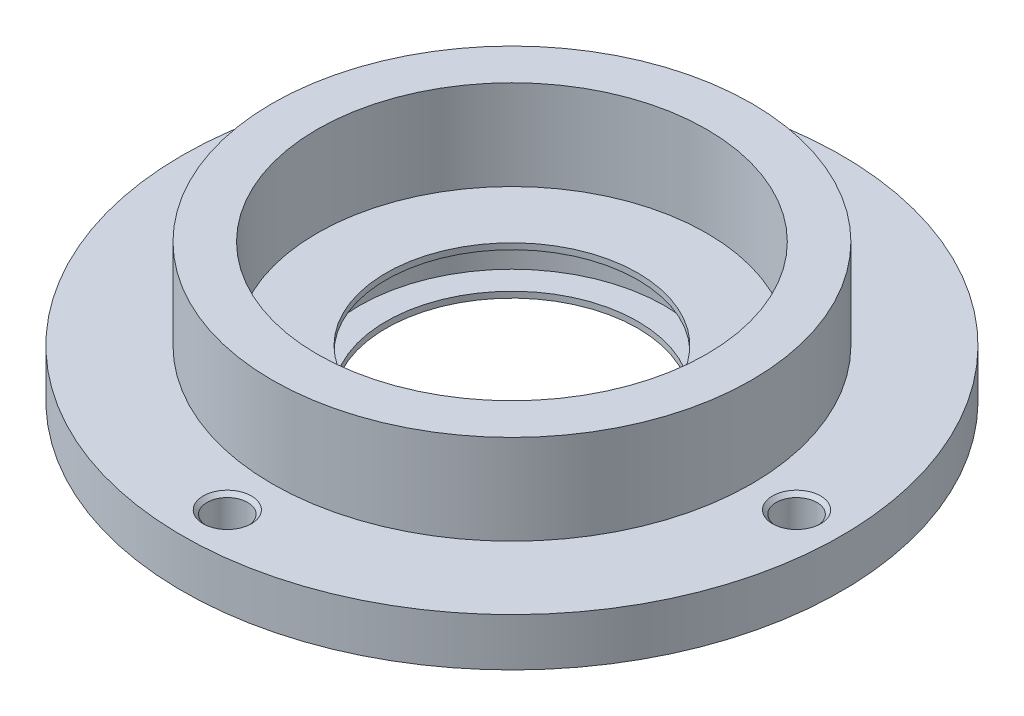
ISO-10303-21;
HEADER;
FILE_DESCRIPTION(('STEP AP214'),'2;1');
FILE_NAME('part.step','',(''),(''),'','','');
FILE_SCHEMA(('AUTOMOTIVE_DESIGN { 1 0 10303 214 1 1 1 1 }'));
ENDSEC;
DATA;
#1=APPLICATION_CONTEXT('core data for automotive mechanical design processes');
#2=APPLICATION_PROTOCOL_DEFINITION('international standard','automotive_design',2000,#1);
#3=PRODUCT_CONTEXT('',#1,'mechanical');
#4=PRODUCT('Part','Part','',(#3));
#5=PRODUCT_RELATED_PRODUCT_CATEGORY('part','',(#4));
#6=PRODUCT_DEFINITION_FORMATION('','',#4);
#7=PRODUCT_DEFINITION_CONTEXT('part definition',#1,'design');
#8=PRODUCT_DEFINITION('design','',#6,#7);
#9=PRODUCT_DEFINITION_SHAPE('','',#8);
#10=(LENGTH_UNIT() NAMED_UNIT(*) SI_UNIT(.MILLI.,.METRE.));
#11=(NAMED_UNIT(*) PLANE_ANGLE_UNIT() SI_UNIT($,.RADIAN.));
#12=(NAMED_UNIT(*) SI_UNIT($,.STERADIAN.) SOLID_ANGLE_UNIT());
#13=UNCERTAINTY_MEASURE_WITH_UNIT(LENGTH_MEASURE(1.E-05),#10,'distance_accuracy_value','');
#14=(GEOMETRIC_REPRESENTATION_CONTEXT(3) GLOBAL_UNCERTAINTY_ASSIGNED_CONTEXT((#13)) GLOBAL_UNIT_ASSIGNED_CONTEXT((#10,
#11,#12)) REPRESENTATION_CONTEXT('',''));
#15=CARTESIAN_POINT('',(0.,0.,0.));
#16=DIRECTION('',(0.,0.,1.));
#17=DIRECTION('',(1.,0.,0.));
#18=AXIS2_PLACEMENT_3D('',#15,#16,#17);
#19=CARTESIAN_POINT('',(0.,21.,0.));
#20=DIRECTION('',(0.,-1.,0.));
#21=DIRECTION('',(0.,0.,-1.));
#22=AXIS2_PLACEMENT_3D('',#19,#20,#21);
#23=CYLINDRICAL_SURFACE('',#22,21.);
#24=CARTESIAN_POINT('',(0.,7.99999999999999,0.));
#25=DIRECTION('',(0.,-1.,0.));
#26=DIRECTION('',(1.,0.,0.));
#27=AXIS2_PLACEMENT_3D('',#24,#25,#26);
#28=CIRCLE('',#27,21.);
#29=CARTESIAN_POINT('',(21.,8.,0.));
#30=VERTEX_POINT('',#29);
#31=EDGE_CURVE('E58',#30,#30,#28,.F.);
#32=ORIENTED_EDGE('',*,*,#31,.T.);
#33=EDGE_LOOP('',(#32));
#34=FACE_BOUND('',#33,.T.);
#35=CARTESIAN_POINT('',(0.,7.,0.));
#36=DIRECTION('',(0.,-1.,0.));
#37=DIRECTION('',(0.,0.,-1.));
#38=AXIS2_PLACEMENT_3D('',#35,#36,#37);
#39=CIRCLE('',#38,21.);
#40=CARTESIAN_POINT('',(0.,7.,-21.));
#41=VERTEX_POINT('',#40);
#42=EDGE_CURVE('E61',#41,#41,#39,.T.);
#43=ORIENTED_EDGE('',*,*,#42,.T.);
#44=EDGE_LOOP('',(#43));
#45=FACE_BOUND('',#44,.T.);
#46=ADVANCED_FACE('F43',(#34,#45),#23,.F.);
#47=CARTESIAN_POINT('',(0.,0.,0.));
#48=DIRECTION('',(0.,1.,0.));
#49=DIRECTION('',(-1.,0.,0.));
#50=AXIS2_PLACEMENT_3D('',#47,#48,#49);
#51=PLANE('',#50);
#52=CARTESIAN_POINT('',(0.,0.,0.));
#53=DIRECTION('',(0.,1.,0.));
#54=DIRECTION('',(0.,0.,1.));
#55=AXIS2_PLACEMENT_3D('',#52,#53,#54);
#56=CIRCLE('',#55,21.);
#57=CARTESIAN_POINT('',(0.,0.,21.));
#58=VERTEX_POINT('',#57);
#59=EDGE_CURVE('E64',#58,#58,#56,.T.);
#60=ORIENTED_EDGE('',*,*,#59,.T.);
#61=EDGE_LOOP('',(#60));
#62=FACE_BOUND('',#61,.T.);
#63=CARTESIAN_POINT('',(-47.5,-1.16226472890446E-13,0.));
#64=DIRECTION('',(0.,1.,0.));
#65=DIRECTION('',(0.,0.,1.));
#66=AXIS2_PLACEMENT_3D('',#63,#64,#65);
#67=CIRCLE('',#66,3.4);
#68=CARTESIAN_POINT('',(-47.5,-1.16226472890446E-13,3.39999999999999));
#69=VERTEX_POINT('',#68);
#70=EDGE_CURVE('E83',#69,#69,#67,.T.);
#71=ORIENTED_EDGE('',*,*,#70,.T.);
#72=EDGE_LOOP('',(#71));
#73=FACE_BOUND('',#72,.T.);
#74=CARTESIAN_POINT('',(47.5,0.,0.));
#75=DIRECTION('',(0.,1.,0.));
#76=DIRECTION('',(0.,0.,1.));
#77=AXIS2_PLACEMENT_3D('',#74,#75,#76);
#78=CIRCLE('',#77,3.4);
#79=CARTESIAN_POINT('',(47.5,0.,3.4));
#80=VERTEX_POINT('',#79);
#81=EDGE_CURVE('E92',#80,#80,#78,.T.);
#82=ORIENTED_EDGE('',*,*,#81,.T.);
#83=EDGE_LOOP('',(#82));
#84=FACE_BOUND('',#83,.T.);
#85=CARTESIAN_POINT('',(0.,0.,47.5));
#86=DIRECTION('',(0.,1.,0.));
#87=DIRECTION('',(0.,0.,1.));
#88=AXIS2_PLACEMENT_3D('',#85,#86,#87);
#89=CIRCLE('',#88,3.4);
#90=CARTESIAN_POINT('',(0.,0.,50.9));
#91=VERTEX_POINT('',#90);
#92=EDGE_CURVE('E101',#91,#91,#89,.T.);
#93=ORIENTED_EDGE('',*,*,#92,.T.);
#94=EDGE_LOOP('',(#93));
#95=FACE_BOUND('',#94,.T.);
#96=CARTESIAN_POINT('',(0.,0.,-47.5));
#97=DIRECTION('',(0.,1.,0.));
#98=DIRECTION('',(0.,0.,1.));
#99=AXIS2_PLACEMENT_3D('',#96,#97,#98);
#100=CIRCLE('',#99,3.4);
#101=CARTESIAN_POINT('',(0.,0.,-44.1));
#102=VERTEX_POINT('',#101);
#103=EDGE_CURVE('E115',#102,#102,#100,.T.);
#104=ORIENTED_EDGE('',*,*,#103,.T.);
#105=EDGE_LOOP('',(#104));
#106=FACE_BOUND('',#105,.T.);
#107=CARTESIAN_POINT('',(0.,0.,0.));
#108=DIRECTION('',(0.,1.,0.));
#109=DIRECTION('',(-1.,0.,0.));
#110=AXIS2_PLACEMENT_3D('',#107,#108,#109);
#111=CIRCLE('',#110,55.);
#112=CARTESIAN_POINT('',(-55.,0.,0.));
#113=VERTEX_POINT('',#112);
#114=EDGE_CURVE('E10',#113,#113,#111,.T.);
#115=ORIENTED_EDGE('',*,*,#114,.F.);
#116=EDGE_LOOP('',(#115));
#117=FACE_BOUND('',#116,.T.);
#118=ADVANCED_FACE('F44',(#62,#73,#84,#95,#106,#117),#51,.F.);
#119=CARTESIAN_POINT('',(0.,8.,0.));
#120=DIRECTION('',(0.,1.,0.));
#121=DIRECTION('',(-1.,0.,0.));
#122=AXIS2_PLACEMENT_3D('',#119,#120,#121);
#123=CYLINDRICAL_SURFACE('',#122,55.);
#124=CARTESIAN_POINT('',(0.,7.99999999999998,0.));
#125=DIRECTION('',(0.,1.,0.));
#126=DIRECTION('',(-1.,0.,0.));
#127=AXIS2_PLACEMENT_3D('',#124,#125,#126);
#128=CIRCLE('',#127,55.);
#129=CARTESIAN_POINT('',(-55.,7.99999999999995,0.));
#130=VERTEX_POINT('',#129);
#131=EDGE_CURVE('E51',#130,#130,#128,.T.);
#132=ORIENTED_EDGE('',*,*,#131,.F.);
#133=EDGE_LOOP('',(#132));
#134=FACE_BOUND('',#133,.T.);
#135=ORIENTED_EDGE('',*,*,#114,.T.);
#136=EDGE_LOOP('',(#135));
#137=FACE_BOUND('',#136,.T.);
#138=ADVANCED_FACE('F133',(#134,#137),#123,.T.);
#139=CARTESIAN_POINT('',(55.,8.,0.));
#140=DIRECTION('',(0.,-1.,0.));
#141=DIRECTION('',(1.,0.,0.));
#142=AXIS2_PLACEMENT_3D('',#139,#140,#141);
#143=PLANE('',#142);
#144=CARTESIAN_POINT('',(-47.5,7.99999999999996,0.));
#145=DIRECTION('',(0.,1.,0.));
#146=DIRECTION('',(0.,0.,1.));
#147=AXIS2_PLACEMENT_3D('',#144,#145,#146);
#148=CIRCLE('',#147,4.025);
#149=CARTESIAN_POINT('',(-47.5,7.99999999999996,4.02499999999999));
#150=VERTEX_POINT('',#149);
#151=EDGE_CURVE('E65',#150,#150,#148,.T.);
#152=ORIENTED_EDGE('',*,*,#151,.F.);
#153=EDGE_LOOP('',(#152));
#154=FACE_BOUND('',#153,.T.);
#155=CARTESIAN_POINT('',(47.5,8.,0.));
#156=DIRECTION('',(0.,1.,0.));
#157=DIRECTION('',(0.,0.,1.));
#158=AXIS2_PLACEMENT_3D('',#155,#156,#157);
#159=CIRCLE('',#158,4.025);
#160=CARTESIAN_POINT('',(47.5,8.,4.025));
#161=VERTEX_POINT('',#160);
#162=EDGE_CURVE('E87',#161,#161,#159,.T.);
#163=ORIENTED_EDGE('',*,*,#162,.F.);
#164=EDGE_LOOP('',(#163));
#165=FACE_BOUND('',#164,.T.);
#166=CARTESIAN_POINT('',(0.,7.99999999999998,47.5));
#167=DIRECTION('',(0.,1.,0.));
#168=DIRECTION('',(0.,0.,1.));
#169=AXIS2_PLACEMENT_3D('',#166,#167,#168);
#170=CIRCLE('',#169,4.025);
#171=CARTESIAN_POINT('',(0.,7.99999999999998,51.525));
#172=VERTEX_POINT('',#171);
#173=EDGE_CURVE('E97',#172,#172,#170,.T.);
#174=ORIENTED_EDGE('',*,*,#173,.F.);
#175=EDGE_LOOP('',(#174));
#176=FACE_BOUND('',#175,.T.);
#177=CARTESIAN_POINT('',(0.,7.99999999999998,-47.5));
#178=DIRECTION('',(0.,1.,0.));
#179=DIRECTION('',(0.,0.,1.));
#180=AXIS2_PLACEMENT_3D('',#177,#178,#179);
#181=CIRCLE('',#180,4.025);
#182=CARTESIAN_POINT('',(0.,7.99999999999998,-43.475));
#183=VERTEX_POINT('',#182);
#184=EDGE_CURVE('E106',#183,#183,#181,.T.);
#185=ORIENTED_EDGE('',*,*,#184,.F.);
#186=EDGE_LOOP('',(#185));
#187=FACE_BOUND('',#186,.T.);
#188=CARTESIAN_POINT('',(0.,7.99999999999998,0.));
#189=DIRECTION('',(0.,1.,0.));
#190=DIRECTION('',(-1.,0.,0.));
#191=AXIS2_PLACEMENT_3D('',#188,#189,#190);
#192=CIRCLE('',#191,40.);
#193=CARTESIAN_POINT('',(-40.,7.99999999999996,0.));
#194=VERTEX_POINT('',#193);
#195=EDGE_CURVE('E57',#194,#194,#192,.T.);
#196=ORIENTED_EDGE('',*,*,#195,.F.);
#197=EDGE_LOOP('',(#196));
#198=FACE_BOUND('',#197,.T.);
#199=ORIENTED_EDGE('',*,*,#131,.T.);
#200=EDGE_LOOP('',(#199));
#201=FACE_BOUND('',#200,.T.);
#202=ADVANCED_FACE('F129',(#154,#165,#176,#187,#198,#201),#143,.F.);
#203=CARTESIAN_POINT('',(0.,8.,0.));
#204=DIRECTION('',(0.,1.,0.));
#205=DIRECTION('',(-1.,0.,0.));
#206=AXIS2_PLACEMENT_3D('',#203,#204,#205);
#207=CYLINDRICAL_SURFACE('',#206,40.);
#208=CARTESIAN_POINT('',(0.,23.,0.));
#209=DIRECTION('',(0.,1.,0.));
#210=DIRECTION('',(-1.,0.,0.));
#211=AXIS2_PLACEMENT_3D('',#208,#209,#210);
#212=CIRCLE('',#211,40.);
#213=CARTESIAN_POINT('',(-40.,23.,0.));
#214=VERTEX_POINT('',#213);
#215=EDGE_CURVE('E122',#214,#214,#212,.T.);
#216=ORIENTED_EDGE('',*,*,#215,.F.);
#217=EDGE_LOOP('',(#216));
#218=FACE_BOUND('',#217,.T.);
#219=ORIENTED_EDGE('',*,*,#195,.T.);
#220=EDGE_LOOP('',(#219));
#221=FACE_BOUND('',#220,.T.);
#222=ADVANCED_FACE('F127',(#218,#221),#207,.T.);
#223=CARTESIAN_POINT('',(40.,23.,0.));
#224=DIRECTION('',(0.,-1.,0.));
#225=DIRECTION('',(1.,0.,0.));
#226=AXIS2_PLACEMENT_3D('',#223,#224,#225);
#227=PLANE('',#226);
#228=CARTESIAN_POINT('',(0.,23.,0.));
#229=DIRECTION('',(0.,1.,0.));
#230=DIRECTION('',(-1.,0.,0.));
#231=AXIS2_PLACEMENT_3D('',#228,#229,#230);
#232=CIRCLE('',#231,32.5);
#233=CARTESIAN_POINT('',(-32.5,23.,0.));
#234=VERTEX_POINT('',#233);
#235=EDGE_CURVE('E117',#234,#234,#232,.T.);
#236=ORIENTED_EDGE('',*,*,#235,.F.);
#237=EDGE_LOOP('',(#236));
#238=FACE_BOUND('',#237,.T.);
#239=ORIENTED_EDGE('',*,*,#215,.T.);
#240=EDGE_LOOP('',(#239));
#241=FACE_BOUND('',#240,.T.);
#242=ADVANCED_FACE('F204',(#238,#241),#227,.F.);
#243=CARTESIAN_POINT('',(0.,8.,0.));
#244=DIRECTION('',(0.,1.,0.));
#245=DIRECTION('',(-1.,0.,0.));
#246=AXIS2_PLACEMENT_3D('',#243,#244,#245);
#247=CYLINDRICAL_SURFACE('',#246,32.5);
#248=CARTESIAN_POINT('',(0.,7.99999999999998,0.));
#249=DIRECTION('',(0.,1.,0.));
#250=DIRECTION('',(-1.,0.,0.));
#251=AXIS2_PLACEMENT_3D('',#248,#249,#250);
#252=CIRCLE('',#251,32.5);
#253=CARTESIAN_POINT('',(-32.5,7.99999999999997,0.));
#254=VERTEX_POINT('',#253);
#255=EDGE_CURVE('E114',#254,#254,#252,.T.);
#256=ORIENTED_EDGE('',*,*,#255,.F.);
#257=EDGE_LOOP('',(#256));
#258=FACE_BOUND('',#257,.T.);
#259=ORIENTED_EDGE('',*,*,#235,.T.);
#260=EDGE_LOOP('',(#259));
#261=FACE_BOUND('',#260,.T.);
#262=ADVANCED_FACE('F203',(#258,#261),#247,.F.);
#263=CARTESIAN_POINT('',(32.5,8.,0.));
#264=DIRECTION('',(0.,-1.,0.));
#265=DIRECTION('',(1.,0.,0.));
#266=AXIS2_PLACEMENT_3D('',#263,#264,#265);
#267=PLANE('',#266);
#268=ORIENTED_EDGE('',*,*,#31,.F.);
#269=EDGE_LOOP('',(#268));
#270=FACE_BOUND('',#269,.T.);
#271=ORIENTED_EDGE('',*,*,#255,.T.);
#272=EDGE_LOOP('',(#271));
#273=FACE_BOUND('',#272,.T.);
#274=ADVANCED_FACE('F179',(#270,#273),#267,.F.);
#275=CARTESIAN_POINT('',(0.,7.99999999999998,-47.5));
#276=DIRECTION('',(0.,1.,0.));
#277=DIRECTION('',(0.,0.,1.));
#278=AXIS2_PLACEMENT_3D('',#275,#276,#277);
#279=CYLINDRICAL_SURFACE('',#278,3.4);
#280=ORIENTED_EDGE('',*,*,#103,.F.);
#281=EDGE_LOOP('',(#280));
#282=FACE_BOUND('',#281,.T.);
#283=CARTESIAN_POINT('',(0.,7.37499999999997,-47.5));
#284=DIRECTION('',(0.,1.,0.));
#285=DIRECTION('',(0.,0.,1.));
#286=AXIS2_PLACEMENT_3D('',#283,#284,#285);
#287=CIRCLE('',#286,3.4);
#288=CARTESIAN_POINT('',(0.,7.37499999999997,-44.1));
#289=VERTEX_POINT('',#288);
#290=EDGE_CURVE('E107',#289,#289,#287,.T.);
#291=ORIENTED_EDGE('',*,*,#290,.T.);
#292=EDGE_LOOP('',(#291));
#293=FACE_BOUND('',#292,.T.);
#294=ADVANCED_FACE('F176',(#282,#293),#279,.F.);
#295=CARTESIAN_POINT('',(0.,7.99999999999998,-47.5));
#296=DIRECTION('',(0.,1.,0.));
#297=DIRECTION('',(0.,0.,1.));
#298=AXIS2_PLACEMENT_3D('',#295,#296,#297);
#299=CONICAL_SURFACE('',#298,4.025,0.785398163397447);
#300=ORIENTED_EDGE('',*,*,#290,.F.);
#301=EDGE_LOOP('',(#300));
#302=FACE_BOUND('',#301,.T.);
#303=ORIENTED_EDGE('',*,*,#184,.T.);
#304=EDGE_LOOP('',(#303));
#305=FACE_BOUND('',#304,.T.);
#306=ADVANCED_FACE('F177',(#302,#305),#299,.F.);
#307=CARTESIAN_POINT('',(0.,7.99999999999998,47.5));
#308=DIRECTION('',(0.,1.,0.));
#309=DIRECTION('',(0.,0.,1.));
#310=AXIS2_PLACEMENT_3D('',#307,#308,#309);
#311=CYLINDRICAL_SURFACE('',#310,3.4);
#312=ORIENTED_EDGE('',*,*,#92,.F.);
#313=EDGE_LOOP('',(#312));
#314=FACE_BOUND('',#313,.T.);
#315=CARTESIAN_POINT('',(0.,7.37499999999997,47.5));
#316=DIRECTION('',(0.,1.,0.));
#317=DIRECTION('',(0.,0.,1.));
#318=AXIS2_PLACEMENT_3D('',#315,#316,#317);
#319=CIRCLE('',#318,3.4);
#320=CARTESIAN_POINT('',(0.,7.37499999999997,50.9));
#321=VERTEX_POINT('',#320);
#322=EDGE_CURVE('E99',#321,#321,#319,.T.);
#323=ORIENTED_EDGE('',*,*,#322,.T.);
#324=EDGE_LOOP('',(#323));
#325=FACE_BOUND('',#324,.T.);
#326=ADVANCED_FACE('F187',(#314,#325),#311,.F.);
#327=CARTESIAN_POINT('',(0.,7.99999999999998,47.5));
#328=DIRECTION('',(0.,1.,0.));
#329=DIRECTION('',(0.,0.,1.));
#330=AXIS2_PLACEMENT_3D('',#327,#328,#329);
#331=CONICAL_SURFACE('',#330,4.025,0.785398163397447);
#332=ORIENTED_EDGE('',*,*,#322,.F.);
#333=EDGE_LOOP('',(#332));
#334=FACE_BOUND('',#333,.T.);
#335=ORIENTED_EDGE('',*,*,#173,.T.);
#336=EDGE_LOOP('',(#335));
#337=FACE_BOUND('',#336,.T.);
#338=ADVANCED_FACE('F193',(#334,#337),#331,.F.);
#339=CARTESIAN_POINT('',(47.5,8.,0.));
#340=DIRECTION('',(0.,1.,0.));
#341=DIRECTION('',(0.,0.,1.));
#342=AXIS2_PLACEMENT_3D('',#339,#340,#341);
#343=CYLINDRICAL_SURFACE('',#342,3.4);
#344=ORIENTED_EDGE('',*,*,#81,.F.);
#345=EDGE_LOOP('',(#344));
#346=FACE_BOUND('',#345,.T.);
#347=CARTESIAN_POINT('',(47.5,7.375,0.));
#348=DIRECTION('',(0.,1.,0.));
#349=DIRECTION('',(0.,0.,1.));
#350=AXIS2_PLACEMENT_3D('',#347,#348,#349);
#351=CIRCLE('',#350,3.4);
#352=CARTESIAN_POINT('',(47.5,7.375,3.4));
#353=VERTEX_POINT('',#352);
#354=EDGE_CURVE('E93',#353,#353,#351,.T.);
#355=ORIENTED_EDGE('',*,*,#354,.T.);
#356=EDGE_LOOP('',(#355));
#357=FACE_BOUND('',#356,.T.);
#358=ADVANCED_FACE('F244',(#346,#357),#343,.F.);
#359=CARTESIAN_POINT('',(47.5,8.,0.));
#360=DIRECTION('',(0.,1.,0.));
#361=DIRECTION('',(0.,0.,1.));
#362=AXIS2_PLACEMENT_3D('',#359,#360,#361);
#363=CONICAL_SURFACE('',#362,4.025,0.785398163397446);
#364=ORIENTED_EDGE('',*,*,#354,.F.);
#365=EDGE_LOOP('',(#364));
#366=FACE_BOUND('',#365,.T.);
#367=ORIENTED_EDGE('',*,*,#162,.T.);
#368=EDGE_LOOP('',(#367));
#369=FACE_BOUND('',#368,.T.);
#370=ADVANCED_FACE('F248',(#366,#369),#363,.F.);
#371=CARTESIAN_POINT('',(-47.5,7.99999999999995,0.));
#372=DIRECTION('',(0.,1.,0.));
#373=DIRECTION('',(0.,0.,1.));
#374=AXIS2_PLACEMENT_3D('',#371,#372,#373);
#375=CYLINDRICAL_SURFACE('',#374,3.4);
#376=ORIENTED_EDGE('',*,*,#70,.F.);
#377=EDGE_LOOP('',(#376));
#378=FACE_BOUND('',#377,.T.);
#379=CARTESIAN_POINT('',(-47.5,7.37499999999995,0.));
#380=DIRECTION('',(0.,1.,0.));
#381=DIRECTION('',(0.,0.,1.));
#382=AXIS2_PLACEMENT_3D('',#379,#380,#381);
#383=CIRCLE('',#382,3.4);
#384=CARTESIAN_POINT('',(-47.5,7.37499999999995,3.39999999999999));
#385=VERTEX_POINT('',#384);
#386=EDGE_CURVE('E85',#385,#385,#383,.T.);
#387=ORIENTED_EDGE('',*,*,#386,.T.);
#388=EDGE_LOOP('',(#387));
#389=FACE_BOUND('',#388,.T.);
#390=ADVANCED_FACE('F163',(#378,#389),#375,.F.);
#391=CARTESIAN_POINT('',(-47.5,7.99999999999996,0.));
#392=DIRECTION('',(0.,1.,0.));
#393=DIRECTION('',(0.,0.,1.));
#394=AXIS2_PLACEMENT_3D('',#391,#392,#393);
#395=CONICAL_SURFACE('',#394,4.025,0.785398163397446);
#396=ORIENTED_EDGE('',*,*,#386,.F.);
#397=EDGE_LOOP('',(#396));
#398=FACE_BOUND('',#397,.T.);
#399=ORIENTED_EDGE('',*,*,#151,.T.);
#400=EDGE_LOOP('',(#399));
#401=FACE_BOUND('',#400,.T.);
#402=ADVANCED_FACE('F152',(#398,#401),#395,.F.);
#403=CARTESIAN_POINT('',(0.,1.,0.));
#404=DIRECTION('',(0.,-1.,0.));
#405=DIRECTION('',(0.,0.,-1.));
#406=AXIS2_PLACEMENT_3D('',#403,#404,#405);
#407=CIRCLE('',#406,21.);
#408=CARTESIAN_POINT('',(0.,1.,-21.));
#409=VERTEX_POINT('',#408);
#410=EDGE_CURVE('E50',#409,#409,#407,.T.);
#411=ORIENTED_EDGE('',*,*,#410,.F.);
#412=EDGE_LOOP('',(#411));
#413=FACE_BOUND('',#412,.T.);
#414=ORIENTED_EDGE('',*,*,#59,.F.);
#415=EDGE_LOOP('',(#414));
#416=FACE_BOUND('',#415,.T.);
#417=ADVANCED_FACE('F143',(#413,#416),#23,.F.);
#418=CARTESIAN_POINT('',(0.,1.,0.));
#419=DIRECTION('',(0.,-1.,0.));
#420=DIRECTION('',(0.,0.,-1.));
#421=AXIS2_PLACEMENT_3D('',#418,#419,#420);
#422=PLANE('',#421);
#423=ORIENTED_EDGE('',*,*,#410,.T.);
#424=EDGE_LOOP('',(#423));
#425=FACE_BOUND('',#424,.T.);
#426=CARTESIAN_POINT('',(0.,1.,0.));
#427=DIRECTION('',(0.,-1.,0.));
#428=DIRECTION('',(0.,0.,-1.));
#429=AXIS2_PLACEMENT_3D('',#426,#427,#428);
#430=CIRCLE('',#429,25.5);
#431=CARTESIAN_POINT('',(0.,1.,-25.5));
#432=VERTEX_POINT('',#431);
#433=EDGE_CURVE('E68',#432,#432,#430,.T.);
#434=ORIENTED_EDGE('',*,*,#433,.F.);
#435=EDGE_LOOP('',(#434));
#436=FACE_BOUND('',#435,.T.);
#437=ADVANCED_FACE('F154',(#425,#436),#422,.F.);
#438=CARTESIAN_POINT('',(0.,0.,0.));
#439=DIRECTION('',(0.,-1.,0.));
#440=DIRECTION('',(0.,0.,-1.));
#441=AXIS2_PLACEMENT_3D('',#438,#439,#440);
#442=CYLINDRICAL_SURFACE('',#441,25.5);
#443=ORIENTED_EDGE('',*,*,#433,.T.);
#444=EDGE_LOOP('',(#443));
#445=FACE_BOUND('',#444,.T.);
#446=CARTESIAN_POINT('',(0.,7.,0.));
#447=DIRECTION('',(0.,-1.,0.));
#448=DIRECTION('',(0.,0.,-1.));
#449=AXIS2_PLACEMENT_3D('',#446,#447,#448);
#450=CIRCLE('',#449,25.5);
#451=CARTESIAN_POINT('',(0.,7.,-25.5));
#452=VERTEX_POINT('',#451);
#453=EDGE_CURVE('E73',#452,#452,#450,.T.);
#454=ORIENTED_EDGE('',*,*,#453,.F.);
#455=EDGE_LOOP('',(#454));
#456=FACE_BOUND('',#455,.T.);
#457=ADVANCED_FACE('F156',(#445,#456),#442,.F.);
#458=CARTESIAN_POINT('',(0.,7.,0.));
#459=DIRECTION('',(0.,-1.,0.));
#460=DIRECTION('',(0.,0.,-1.));
#461=AXIS2_PLACEMENT_3D('',#458,#459,#460);
#462=PLANE('',#461);
#463=ORIENTED_EDGE('',*,*,#42,.F.);
#464=EDGE_LOOP('',(#463));
#465=FACE_BOUND('',#464,.T.);
#466=ORIENTED_EDGE('',*,*,#453,.T.);
#467=EDGE_LOOP('',(#466));
#468=FACE_BOUND('',#467,.T.);
#469=ADVANCED_FACE('F347',(#465,#468),#462,.T.);
#470=CLOSED_SHELL('',(#46,#118,#138,#202,#222,#242,#262,#274,#294,#306,#326,#338,#358,#370,#390,
#402,#417,#437,#457,#469));
#471=MANIFOLD_SOLID_BREP('B2',#470);
#472=ADVANCED_BREP_SHAPE_REPRESENTATION('',(#18,#471),#14);
#473=SHAPE_DEFINITION_REPRESENTATION(#9,#472);
ENDSEC;
END-ISO-10303-21;
